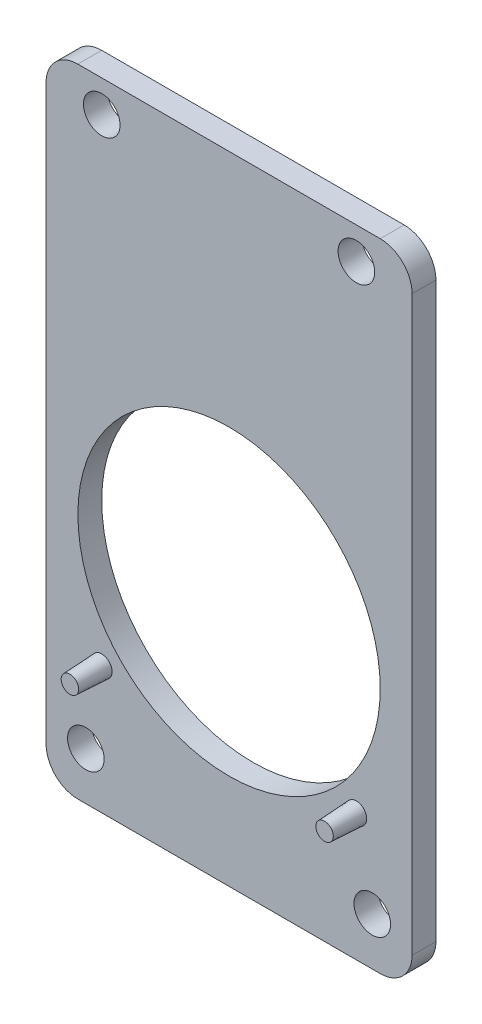
ISO-10303-21;
HEADER;
FILE_DESCRIPTION(('STEP AP214'),'2;1');
FILE_NAME('part.step','',(''),(''),'','','');
FILE_SCHEMA(('AUTOMOTIVE_DESIGN { 1 0 10303 214 1 1 1 1 }'));
ENDSEC;
DATA;
#1=APPLICATION_CONTEXT('core data for automotive mechanical design processes');
#2=APPLICATION_PROTOCOL_DEFINITION('international standard','automotive_design',2000,#1);
#3=PRODUCT_CONTEXT('',#1,'mechanical');
#4=PRODUCT('Part','Part','',(#3));
#5=PRODUCT_RELATED_PRODUCT_CATEGORY('part','',(#4));
#6=PRODUCT_DEFINITION_FORMATION('','',#4);
#7=PRODUCT_DEFINITION_CONTEXT('part definition',#1,'design');
#8=PRODUCT_DEFINITION('design','',#6,#7);
#9=PRODUCT_DEFINITION_SHAPE('','',#8);
#10=(LENGTH_UNIT() NAMED_UNIT(*) SI_UNIT(.MILLI.,.METRE.));
#11=(NAMED_UNIT(*) PLANE_ANGLE_UNIT() SI_UNIT($,.RADIAN.));
#12=(NAMED_UNIT(*) SI_UNIT($,.STERADIAN.) SOLID_ANGLE_UNIT());
#13=UNCERTAINTY_MEASURE_WITH_UNIT(LENGTH_MEASURE(1.E-05),#10,'distance_accuracy_value','');
#14=(GEOMETRIC_REPRESENTATION_CONTEXT(3) GLOBAL_UNCERTAINTY_ASSIGNED_CONTEXT((#13)) GLOBAL_UNIT_ASSIGNED_CONTEXT((#10,
#11,#12)) REPRESENTATION_CONTEXT('',''));
#15=CARTESIAN_POINT('',(0.,0.,0.));
#16=DIRECTION('',(0.,0.,1.));
#17=DIRECTION('',(1.,0.,0.));
#18=AXIS2_PLACEMENT_3D('',#15,#16,#17);
#19=CARTESIAN_POINT('',(0.,0.,1.5));
#20=DIRECTION('',(0.,0.,-1.));
#21=DIRECTION('',(-1.,0.,0.));
#22=AXIS2_PLACEMENT_3D('',#19,#20,#21);
#23=PLANE('',#22);
#24=CARTESIAN_POINT('',(8.,-12.,1.5));
#25=DIRECTION('',(0.,0.,-1.));
#26=DIRECTION('',(-1.,0.,0.));
#27=AXIS2_PLACEMENT_3D('',#24,#25,#26);
#28=CIRCLE('',#27,0.649999999999999);
#29=CARTESIAN_POINT('',(7.35,-12.,1.5));
#30=VERTEX_POINT('',#29);
#31=EDGE_CURVE('E193',#30,#30,#28,.F.);
#32=ORIENTED_EDGE('',*,*,#31,.F.);
#33=EDGE_LOOP('',(#32));
#34=FACE_BOUND('',#33,.T.);
#35=CARTESIAN_POINT('',(-8.,-12.,1.5));
#36=DIRECTION('',(0.,0.,-1.));
#37=DIRECTION('',(-1.,0.,0.));
#38=AXIS2_PLACEMENT_3D('',#35,#36,#37);
#39=CIRCLE('',#38,0.65);
#40=CARTESIAN_POINT('',(-8.65,-12.,1.5));
#41=VERTEX_POINT('',#40);
#42=EDGE_CURVE('E189',#41,#41,#39,.F.);
#43=ORIENTED_EDGE('',*,*,#42,.F.);
#44=EDGE_LOOP('',(#43));
#45=FACE_BOUND('',#44,.T.);
#46=CARTESIAN_POINT('',(8.,18.,1.5));
#47=DIRECTION('',(0.,0.,1.));
#48=DIRECTION('',(1.,0.,0.));
#49=AXIS2_PLACEMENT_3D('',#46,#47,#48);
#50=CIRCLE('',#49,1.15);
#51=CARTESIAN_POINT('',(9.15,18.,1.5));
#52=VERTEX_POINT('',#51);
#53=EDGE_CURVE('E301',#52,#52,#50,.T.);
#54=ORIENTED_EDGE('',*,*,#53,.F.);
#55=EDGE_LOOP('',(#54));
#56=FACE_BOUND('',#55,.T.);
#57=CARTESIAN_POINT('',(-9.,-17.,1.5));
#58=DIRECTION('',(0.,0.,1.));
#59=DIRECTION('',(1.,0.,0.));
#60=AXIS2_PLACEMENT_3D('',#57,#58,#59);
#61=CIRCLE('',#60,1.15);
#62=CARTESIAN_POINT('',(-7.85,-17.,1.5));
#63=VERTEX_POINT('',#62);
#64=EDGE_CURVE('E293',#63,#63,#61,.T.);
#65=ORIENTED_EDGE('',*,*,#64,.F.);
#66=EDGE_LOOP('',(#65));
#67=FACE_BOUND('',#66,.T.);
#68=CARTESIAN_POINT('',(9.,-17.,1.5));
#69=DIRECTION('',(0.,0.,1.));
#70=DIRECTION('',(1.,0.,0.));
#71=AXIS2_PLACEMENT_3D('',#68,#69,#70);
#72=CIRCLE('',#71,1.15);
#73=CARTESIAN_POINT('',(10.15,-17.,1.5));
#74=VERTEX_POINT('',#73);
#75=EDGE_CURVE('E308',#74,#74,#72,.T.);
#76=ORIENTED_EDGE('',*,*,#75,.F.);
#77=EDGE_LOOP('',(#76));
#78=FACE_BOUND('',#77,.T.);
#79=CARTESIAN_POINT('',(-8.,18.,1.5));
#80=DIRECTION('',(0.,0.,1.));
#81=DIRECTION('',(1.,0.,0.));
#82=AXIS2_PLACEMENT_3D('',#79,#80,#81);
#83=CIRCLE('',#82,1.15);
#84=CARTESIAN_POINT('',(-6.85,18.,1.5));
#85=VERTEX_POINT('',#84);
#86=EDGE_CURVE('E285',#85,#85,#83,.T.);
#87=ORIENTED_EDGE('',*,*,#86,.F.);
#88=EDGE_LOOP('',(#87));
#89=FACE_BOUND('',#88,.T.);
#90=DIRECTION('',(0.,-1.,0.));
#91=VECTOR('',#90,1.);
#92=CARTESIAN_POINT('',(-11.5,-20.,1.5));
#93=LINE('',#92,#91);
#94=CARTESIAN_POINT('',(-11.5,18.,1.5));
#95=VERTEX_POINT('',#94);
#96=CARTESIAN_POINT('',(-11.5,-18.,1.5));
#97=VERTEX_POINT('',#96);
#98=EDGE_CURVE('E272',#95,#97,#93,.T.);
#99=ORIENTED_EDGE('',*,*,#98,.T.);
#100=CARTESIAN_POINT('',(-9.5,-18.,1.5));
#101=DIRECTION('',(0.,0.,-1.));
#102=DIRECTION('',(-1.,0.,0.));
#103=AXIS2_PLACEMENT_3D('',#100,#101,#102);
#104=CIRCLE('',#103,2.);
#105=CARTESIAN_POINT('',(-9.5,-20.,1.5));
#106=VERTEX_POINT('',#105);
#107=EDGE_CURVE('E173',#97,#106,#104,.F.);
#108=ORIENTED_EDGE('',*,*,#107,.T.);
#109=DIRECTION('',(1.,0.,0.));
#110=VECTOR('',#109,1.);
#111=CARTESIAN_POINT('',(-11.5,-20.,1.5));
#112=LINE('',#111,#110);
#113=CARTESIAN_POINT('',(9.5,-20.,1.5));
#114=VERTEX_POINT('',#113);
#115=EDGE_CURVE('E130',#106,#114,#112,.T.);
#116=ORIENTED_EDGE('',*,*,#115,.T.);
#117=CARTESIAN_POINT('',(9.5,-18.,1.5));
#118=DIRECTION('',(0.,0.,-1.));
#119=DIRECTION('',(-1.,0.,0.));
#120=AXIS2_PLACEMENT_3D('',#117,#118,#119);
#121=CIRCLE('',#120,2.);
#122=CARTESIAN_POINT('',(11.5,-18.,1.5));
#123=VERTEX_POINT('',#122);
#124=EDGE_CURVE('E170',#114,#123,#121,.F.);
#125=ORIENTED_EDGE('',*,*,#124,.T.);
#126=DIRECTION('',(0.,1.,0.));
#127=VECTOR('',#126,1.);
#128=CARTESIAN_POINT('',(11.5,-20.,1.5));
#129=LINE('',#128,#127);
#130=CARTESIAN_POINT('',(11.5,18.,1.5));
#131=VERTEX_POINT('',#130);
#132=EDGE_CURVE('E139',#123,#131,#129,.T.);
#133=ORIENTED_EDGE('',*,*,#132,.T.);
#134=CARTESIAN_POINT('',(9.5,18.,1.5));
#135=DIRECTION('',(0.,0.,-1.));
#136=DIRECTION('',(-1.,0.,0.));
#137=AXIS2_PLACEMENT_3D('',#134,#135,#136);
#138=CIRCLE('',#137,2.);
#139=CARTESIAN_POINT('',(9.5,20.,1.5));
#140=VERTEX_POINT('',#139);
#141=EDGE_CURVE('E64',#131,#140,#138,.F.);
#142=ORIENTED_EDGE('',*,*,#141,.T.);
#143=DIRECTION('',(-1.,0.,0.));
#144=VECTOR('',#143,1.);
#145=CARTESIAN_POINT('',(-11.5,20.,1.5));
#146=LINE('',#145,#144);
#147=CARTESIAN_POINT('',(-9.5,20.,1.5));
#148=VERTEX_POINT('',#147);
#149=EDGE_CURVE('E144',#140,#148,#146,.T.);
#150=ORIENTED_EDGE('',*,*,#149,.T.);
#151=CARTESIAN_POINT('',(-9.5,18.,1.5));
#152=DIRECTION('',(0.,0.,-1.));
#153=DIRECTION('',(-1.,0.,0.));
#154=AXIS2_PLACEMENT_3D('',#151,#152,#153);
#155=CIRCLE('',#154,2.);
#156=EDGE_CURVE('E167',#148,#95,#155,.F.);
#157=ORIENTED_EDGE('',*,*,#156,.T.);
#158=EDGE_LOOP('',(#99,#108,#116,#125,#133,#142,#150,#157));
#159=FACE_BOUND('',#158,.T.);
#160=CARTESIAN_POINT('',(0.,-4.5,1.5));
#161=DIRECTION('',(0.,0.,1.));
#162=DIRECTION('',(1.,0.,0.));
#163=AXIS2_PLACEMENT_3D('',#160,#161,#162);
#164=CIRCLE('',#163,9.5);
#165=CARTESIAN_POINT('',(9.5,-4.5,1.5));
#166=VERTEX_POINT('',#165);
#167=EDGE_CURVE('E267',#166,#166,#164,.T.);
#168=ORIENTED_EDGE('',*,*,#167,.F.);
#169=EDGE_LOOP('',(#168));
#170=FACE_BOUND('',#169,.T.);
#171=ADVANCED_FACE('F40',(#34,#45,#56,#67,#78,#89,#159,#170),#23,.F.);
#172=CARTESIAN_POINT('',(0.,0.,0.));
#173=DIRECTION('',(0.,0.,-1.));
#174=DIRECTION('',(-1.,0.,0.));
#175=AXIS2_PLACEMENT_3D('',#172,#173,#174);
#176=PLANE('',#175);
#177=CARTESIAN_POINT('',(8.,18.,0.));
#178=DIRECTION('',(0.,0.,1.));
#179=DIRECTION('',(1.,0.,0.));
#180=AXIS2_PLACEMENT_3D('',#177,#178,#179);
#181=CIRCLE('',#180,1.15);
#182=CARTESIAN_POINT('',(9.15,18.,0.));
#183=VERTEX_POINT('',#182);
#184=EDGE_CURVE('E289',#183,#183,#181,.T.);
#185=ORIENTED_EDGE('',*,*,#184,.T.);
#186=EDGE_LOOP('',(#185));
#187=FACE_BOUND('',#186,.T.);
#188=CARTESIAN_POINT('',(-9.,-17.,0.));
#189=DIRECTION('',(0.,0.,1.));
#190=DIRECTION('',(1.,0.,0.));
#191=AXIS2_PLACEMENT_3D('',#188,#189,#190);
#192=CIRCLE('',#191,1.15);
#193=CARTESIAN_POINT('',(-7.85,-17.,0.));
#194=VERTEX_POINT('',#193);
#195=EDGE_CURVE('E296',#194,#194,#192,.T.);
#196=ORIENTED_EDGE('',*,*,#195,.T.);
#197=EDGE_LOOP('',(#196));
#198=FACE_BOUND('',#197,.T.);
#199=CARTESIAN_POINT('',(9.,-17.,0.));
#200=DIRECTION('',(0.,0.,1.));
#201=DIRECTION('',(1.,0.,0.));
#202=AXIS2_PLACEMENT_3D('',#199,#200,#201);
#203=CIRCLE('',#202,1.15);
#204=CARTESIAN_POINT('',(10.15,-17.,0.));
#205=VERTEX_POINT('',#204);
#206=EDGE_CURVE('E297',#205,#205,#203,.T.);
#207=ORIENTED_EDGE('',*,*,#206,.T.);
#208=EDGE_LOOP('',(#207));
#209=FACE_BOUND('',#208,.T.);
#210=CARTESIAN_POINT('',(-8.,18.,0.));
#211=DIRECTION('',(0.,0.,1.));
#212=DIRECTION('',(1.,0.,0.));
#213=AXIS2_PLACEMENT_3D('',#210,#211,#212);
#214=CIRCLE('',#213,1.15);
#215=CARTESIAN_POINT('',(-6.85,18.,0.));
#216=VERTEX_POINT('',#215);
#217=EDGE_CURVE('E281',#216,#216,#214,.T.);
#218=ORIENTED_EDGE('',*,*,#217,.T.);
#219=EDGE_LOOP('',(#218));
#220=FACE_BOUND('',#219,.T.);
#221=DIRECTION('',(1.,0.,0.));
#222=VECTOR('',#221,1.);
#223=CARTESIAN_POINT('',(-11.5,-20.,0.));
#224=LINE('',#223,#222);
#225=CARTESIAN_POINT('',(-9.5,-20.,0.));
#226=VERTEX_POINT('',#225);
#227=CARTESIAN_POINT('',(9.5,-20.,0.));
#228=VERTEX_POINT('',#227);
#229=EDGE_CURVE('E127',#226,#228,#224,.T.);
#230=ORIENTED_EDGE('',*,*,#229,.F.);
#231=CARTESIAN_POINT('',(-9.5,-18.,0.));
#232=DIRECTION('',(0.,0.,-1.));
#233=DIRECTION('',(-1.,0.,0.));
#234=AXIS2_PLACEMENT_3D('',#231,#232,#233);
#235=CIRCLE('',#234,2.);
#236=CARTESIAN_POINT('',(-11.5,-18.,0.));
#237=VERTEX_POINT('',#236);
#238=EDGE_CURVE('E109',#226,#237,#235,.T.);
#239=ORIENTED_EDGE('',*,*,#238,.T.);
#240=DIRECTION('',(0.,-1.,0.));
#241=VECTOR('',#240,1.);
#242=CARTESIAN_POINT('',(-11.5,-20.,0.));
#243=LINE('',#242,#241);
#244=CARTESIAN_POINT('',(-11.5,18.,0.));
#245=VERTEX_POINT('',#244);
#246=EDGE_CURVE('E140',#245,#237,#243,.T.);
#247=ORIENTED_EDGE('',*,*,#246,.F.);
#248=CARTESIAN_POINT('',(-9.5,18.,0.));
#249=DIRECTION('',(0.,0.,-1.));
#250=DIRECTION('',(-1.,0.,0.));
#251=AXIS2_PLACEMENT_3D('',#248,#249,#250);
#252=CIRCLE('',#251,2.);
#253=CARTESIAN_POINT('',(-9.5,20.,0.));
#254=VERTEX_POINT('',#253);
#255=EDGE_CURVE('E155',#245,#254,#252,.T.);
#256=ORIENTED_EDGE('',*,*,#255,.T.);
#257=DIRECTION('',(-1.,0.,0.));
#258=VECTOR('',#257,1.);
#259=CARTESIAN_POINT('',(-11.5,20.,0.));
#260=LINE('',#259,#258);
#261=CARTESIAN_POINT('',(9.5,20.,0.));
#262=VERTEX_POINT('',#261);
#263=EDGE_CURVE('E147',#262,#254,#260,.T.);
#264=ORIENTED_EDGE('',*,*,#263,.F.);
#265=CARTESIAN_POINT('',(9.5,18.,0.));
#266=DIRECTION('',(0.,0.,-1.));
#267=DIRECTION('',(-1.,0.,0.));
#268=AXIS2_PLACEMENT_3D('',#265,#266,#267);
#269=CIRCLE('',#268,2.);
#270=CARTESIAN_POINT('',(11.5,18.,0.));
#271=VERTEX_POINT('',#270);
#272=EDGE_CURVE('E132',#262,#271,#269,.T.);
#273=ORIENTED_EDGE('',*,*,#272,.T.);
#274=DIRECTION('',(0.,1.,0.));
#275=VECTOR('',#274,1.);
#276=CARTESIAN_POINT('',(11.5,-20.,0.));
#277=LINE('',#276,#275);
#278=CARTESIAN_POINT('',(11.5,-18.,0.));
#279=VERTEX_POINT('',#278);
#280=EDGE_CURVE('E264',#279,#271,#277,.T.);
#281=ORIENTED_EDGE('',*,*,#280,.F.);
#282=CARTESIAN_POINT('',(9.5,-18.,0.));
#283=DIRECTION('',(0.,0.,-1.));
#284=DIRECTION('',(-1.,0.,0.));
#285=AXIS2_PLACEMENT_3D('',#282,#283,#284);
#286=CIRCLE('',#285,2.);
#287=EDGE_CURVE('E121',#279,#228,#286,.T.);
#288=ORIENTED_EDGE('',*,*,#287,.T.);
#289=EDGE_LOOP('',(#230,#239,#247,#256,#264,#273,#281,#288));
#290=FACE_BOUND('',#289,.T.);
#291=CARTESIAN_POINT('',(0.,-4.5,0.));
#292=DIRECTION('',(0.,0.,1.));
#293=DIRECTION('',(1.,0.,0.));
#294=AXIS2_PLACEMENT_3D('',#291,#292,#293);
#295=CIRCLE('',#294,9.5);
#296=CARTESIAN_POINT('',(9.5,-4.5,0.));
#297=VERTEX_POINT('',#296);
#298=EDGE_CURVE('E277',#297,#297,#295,.T.);
#299=ORIENTED_EDGE('',*,*,#298,.T.);
#300=EDGE_LOOP('',(#299));
#301=FACE_BOUND('',#300,.T.);
#302=ADVANCED_FACE('F135',(#187,#198,#209,#220,#290,#301),#176,.T.);
#303=CARTESIAN_POINT('',(11.5,-20.,1.5));
#304=DIRECTION('',(-1.,0.,0.));
#305=DIRECTION('',(0.,0.,1.));
#306=AXIS2_PLACEMENT_3D('',#303,#304,#305);
#307=PLANE('',#306);
#308=ORIENTED_EDGE('',*,*,#132,.F.);
#309=DIRECTION('',(0.,0.,-1.));
#310=VECTOR('',#309,1.);
#311=CARTESIAN_POINT('',(11.5,-18.,1.5));
#312=LINE('',#311,#310);
#313=EDGE_CURVE('E179',#123,#279,#312,.T.);
#314=ORIENTED_EDGE('',*,*,#313,.T.);
#315=ORIENTED_EDGE('',*,*,#280,.T.);
#316=DIRECTION('',(0.,0.,-1.));
#317=VECTOR('',#316,1.);
#318=CARTESIAN_POINT('',(11.5,18.,1.5));
#319=LINE('',#318,#317);
#320=EDGE_CURVE('E176',#271,#131,#319,.F.);
#321=ORIENTED_EDGE('',*,*,#320,.T.);
#322=EDGE_LOOP('',(#308,#314,#315,#321));
#323=FACE_BOUND('',#322,.T.);
#324=ADVANCED_FACE('F221',(#323),#307,.F.);
#325=CARTESIAN_POINT('',(-11.5,20.,1.5));
#326=DIRECTION('',(0.,-1.,0.));
#327=DIRECTION('',(0.,0.,-1.));
#328=AXIS2_PLACEMENT_3D('',#325,#326,#327);
#329=PLANE('',#328);
#330=ORIENTED_EDGE('',*,*,#263,.T.);
#331=DIRECTION('',(0.,0.,-1.));
#332=VECTOR('',#331,1.);
#333=CARTESIAN_POINT('',(-9.5,20.,1.5));
#334=LINE('',#333,#332);
#335=EDGE_CURVE('E57',#254,#148,#334,.F.);
#336=ORIENTED_EDGE('',*,*,#335,.T.);
#337=ORIENTED_EDGE('',*,*,#149,.F.);
#338=DIRECTION('',(0.,0.,-1.));
#339=VECTOR('',#338,1.);
#340=CARTESIAN_POINT('',(9.5,20.,1.5));
#341=LINE('',#340,#339);
#342=EDGE_CURVE('E183',#140,#262,#341,.T.);
#343=ORIENTED_EDGE('',*,*,#342,.T.);
#344=EDGE_LOOP('',(#330,#336,#337,#343));
#345=FACE_BOUND('',#344,.T.);
#346=ADVANCED_FACE('F235',(#345),#329,.F.);
#347=CARTESIAN_POINT('',(-11.5,-20.,1.5));
#348=DIRECTION('',(1.,0.,0.));
#349=DIRECTION('',(0.,0.,-1.));
#350=AXIS2_PLACEMENT_3D('',#347,#348,#349);
#351=PLANE('',#350);
#352=ORIENTED_EDGE('',*,*,#246,.T.);
#353=DIRECTION('',(0.,0.,-1.));
#354=VECTOR('',#353,1.);
#355=CARTESIAN_POINT('',(-11.5,-18.,1.5));
#356=LINE('',#355,#354);
#357=EDGE_CURVE('E114',#237,#97,#356,.F.);
#358=ORIENTED_EDGE('',*,*,#357,.T.);
#359=ORIENTED_EDGE('',*,*,#98,.F.);
#360=DIRECTION('',(0.,0.,-1.));
#361=VECTOR('',#360,1.);
#362=CARTESIAN_POINT('',(-11.5,18.,1.5));
#363=LINE('',#362,#361);
#364=EDGE_CURVE('E120',#95,#245,#363,.T.);
#365=ORIENTED_EDGE('',*,*,#364,.T.);
#366=EDGE_LOOP('',(#352,#358,#359,#365));
#367=FACE_BOUND('',#366,.T.);
#368=ADVANCED_FACE('F232',(#367),#351,.F.);
#369=CARTESIAN_POINT('',(-11.5,-20.,1.5));
#370=DIRECTION('',(0.,1.,0.));
#371=DIRECTION('',(0.,0.,1.));
#372=AXIS2_PLACEMENT_3D('',#369,#370,#371);
#373=PLANE('',#372);
#374=ORIENTED_EDGE('',*,*,#115,.F.);
#375=DIRECTION('',(0.,0.,-1.));
#376=VECTOR('',#375,1.);
#377=CARTESIAN_POINT('',(-9.5,-20.,1.5));
#378=LINE('',#377,#376);
#379=EDGE_CURVE('E113',#106,#226,#378,.T.);
#380=ORIENTED_EDGE('',*,*,#379,.T.);
#381=ORIENTED_EDGE('',*,*,#229,.T.);
#382=DIRECTION('',(0.,0.,-1.));
#383=VECTOR('',#382,1.);
#384=CARTESIAN_POINT('',(9.5,-20.,1.5));
#385=LINE('',#384,#383);
#386=EDGE_CURVE('E133',#228,#114,#385,.F.);
#387=ORIENTED_EDGE('',*,*,#386,.T.);
#388=EDGE_LOOP('',(#374,#380,#381,#387));
#389=FACE_BOUND('',#388,.T.);
#390=ADVANCED_FACE('F126',(#389),#373,.F.);
#391=CARTESIAN_POINT('',(0.,-4.5,1.5));
#392=DIRECTION('',(0.,0.,-1.));
#393=DIRECTION('',(-1.,0.,0.));
#394=AXIS2_PLACEMENT_3D('',#391,#392,#393);
#395=CYLINDRICAL_SURFACE('',#394,9.5);
#396=ORIENTED_EDGE('',*,*,#167,.T.);
#397=EDGE_LOOP('',(#396));
#398=FACE_BOUND('',#397,.T.);
#399=ORIENTED_EDGE('',*,*,#298,.F.);
#400=EDGE_LOOP('',(#399));
#401=FACE_BOUND('',#400,.T.);
#402=ADVANCED_FACE('F227',(#398,#401),#395,.F.);
#403=CARTESIAN_POINT('',(-9.5,-18.,1.5));
#404=DIRECTION('',(0.,0.,-1.));
#405=DIRECTION('',(-1.,0.,0.));
#406=AXIS2_PLACEMENT_3D('',#403,#404,#405);
#407=CYLINDRICAL_SURFACE('',#406,2.);
#408=ORIENTED_EDGE('',*,*,#107,.F.);
#409=ORIENTED_EDGE('',*,*,#357,.F.);
#410=ORIENTED_EDGE('',*,*,#238,.F.);
#411=ORIENTED_EDGE('',*,*,#379,.F.);
#412=EDGE_LOOP('',(#408,#409,#410,#411));
#413=FACE_BOUND('',#412,.T.);
#414=ADVANCED_FACE('F112',(#413),#407,.T.);
#415=CARTESIAN_POINT('',(9.5,-18.,1.5));
#416=DIRECTION('',(0.,0.,-1.));
#417=DIRECTION('',(-1.,0.,0.));
#418=AXIS2_PLACEMENT_3D('',#415,#416,#417);
#419=CYLINDRICAL_SURFACE('',#418,2.);
#420=ORIENTED_EDGE('',*,*,#124,.F.);
#421=ORIENTED_EDGE('',*,*,#386,.F.);
#422=ORIENTED_EDGE('',*,*,#287,.F.);
#423=ORIENTED_EDGE('',*,*,#313,.F.);
#424=EDGE_LOOP('',(#420,#421,#422,#423));
#425=FACE_BOUND('',#424,.T.);
#426=ADVANCED_FACE('F244',(#425),#419,.T.);
#427=CARTESIAN_POINT('',(-9.5,18.,1.5));
#428=DIRECTION('',(0.,0.,-1.));
#429=DIRECTION('',(-1.,0.,0.));
#430=AXIS2_PLACEMENT_3D('',#427,#428,#429);
#431=CYLINDRICAL_SURFACE('',#430,2.);
#432=ORIENTED_EDGE('',*,*,#156,.F.);
#433=ORIENTED_EDGE('',*,*,#335,.F.);
#434=ORIENTED_EDGE('',*,*,#255,.F.);
#435=ORIENTED_EDGE('',*,*,#364,.F.);
#436=EDGE_LOOP('',(#432,#433,#434,#435));
#437=FACE_BOUND('',#436,.T.);
#438=ADVANCED_FACE('F247',(#437),#431,.T.);
#439=CARTESIAN_POINT('',(9.5,18.,1.5));
#440=DIRECTION('',(0.,0.,-1.));
#441=DIRECTION('',(-1.,0.,0.));
#442=AXIS2_PLACEMENT_3D('',#439,#440,#441);
#443=CYLINDRICAL_SURFACE('',#442,2.);
#444=ORIENTED_EDGE('',*,*,#141,.F.);
#445=ORIENTED_EDGE('',*,*,#320,.F.);
#446=ORIENTED_EDGE('',*,*,#272,.F.);
#447=ORIENTED_EDGE('',*,*,#342,.F.);
#448=EDGE_LOOP('',(#444,#445,#446,#447));
#449=FACE_BOUND('',#448,.T.);
#450=ADVANCED_FACE('F250',(#449),#443,.T.);
#451=CARTESIAN_POINT('',(-8.,18.,0.));
#452=DIRECTION('',(0.,0.,1.));
#453=DIRECTION('',(1.,0.,0.));
#454=AXIS2_PLACEMENT_3D('',#451,#452,#453);
#455=CYLINDRICAL_SURFACE('',#454,1.15);
#456=ORIENTED_EDGE('',*,*,#217,.F.);
#457=EDGE_LOOP('',(#456));
#458=FACE_BOUND('',#457,.T.);
#459=ORIENTED_EDGE('',*,*,#86,.T.);
#460=EDGE_LOOP('',(#459));
#461=FACE_BOUND('',#460,.T.);
#462=ADVANCED_FACE('F253',(#458,#461),#455,.F.);
#463=CARTESIAN_POINT('',(9.,-17.,0.));
#464=DIRECTION('',(0.,0.,1.));
#465=DIRECTION('',(1.,0.,0.));
#466=AXIS2_PLACEMENT_3D('',#463,#464,#465);
#467=CYLINDRICAL_SURFACE('',#466,1.15);
#468=ORIENTED_EDGE('',*,*,#206,.F.);
#469=EDGE_LOOP('',(#468));
#470=FACE_BOUND('',#469,.T.);
#471=ORIENTED_EDGE('',*,*,#75,.T.);
#472=EDGE_LOOP('',(#471));
#473=FACE_BOUND('',#472,.T.);
#474=ADVANCED_FACE('F258',(#470,#473),#467,.F.);
#475=CARTESIAN_POINT('',(-9.,-17.,0.));
#476=DIRECTION('',(0.,0.,1.));
#477=DIRECTION('',(1.,0.,0.));
#478=AXIS2_PLACEMENT_3D('',#475,#476,#477);
#479=CYLINDRICAL_SURFACE('',#478,1.15);
#480=ORIENTED_EDGE('',*,*,#195,.F.);
#481=EDGE_LOOP('',(#480));
#482=FACE_BOUND('',#481,.T.);
#483=ORIENTED_EDGE('',*,*,#64,.T.);
#484=EDGE_LOOP('',(#483));
#485=FACE_BOUND('',#484,.T.);
#486=ADVANCED_FACE('F320',(#482,#485),#479,.F.);
#487=CARTESIAN_POINT('',(8.,18.,0.));
#488=DIRECTION('',(0.,0.,1.));
#489=DIRECTION('',(1.,0.,0.));
#490=AXIS2_PLACEMENT_3D('',#487,#488,#489);
#491=CYLINDRICAL_SURFACE('',#490,1.15);
#492=ORIENTED_EDGE('',*,*,#184,.F.);
#493=EDGE_LOOP('',(#492));
#494=FACE_BOUND('',#493,.T.);
#495=ORIENTED_EDGE('',*,*,#53,.T.);
#496=EDGE_LOOP('',(#495));
#497=FACE_BOUND('',#496,.T.);
#498=ADVANCED_FACE('F367',(#494,#497),#491,.F.);
#499=CARTESIAN_POINT('',(-8.,-12.,3.5));
#500=DIRECTION('',(0.,0.,1.));
#501=DIRECTION('',(1.,0.,0.));
#502=AXIS2_PLACEMENT_3D('',#499,#500,#501);
#503=PLANE('',#502);
#504=CARTESIAN_POINT('',(-8.,-12.,3.5));
#505=DIRECTION('',(0.,0.,1.));
#506=DIRECTION('',(1.,0.,0.));
#507=AXIS2_PLACEMENT_3D('',#504,#505,#506);
#508=CIRCLE('',#507,0.549999999999997);
#509=CARTESIAN_POINT('',(-7.45,-12.,3.5));
#510=VERTEX_POINT('',#509);
#511=EDGE_CURVE('E11',#510,#510,#508,.T.);
#512=ORIENTED_EDGE('',*,*,#511,.T.);
#513=EDGE_LOOP('',(#512));
#514=FACE_BOUND('',#513,.T.);
#515=ADVANCED_FACE('F211',(#514),#503,.T.);
#516=CARTESIAN_POINT('',(8.,-12.,3.5));
#517=DIRECTION('',(0.,0.,1.));
#518=DIRECTION('',(1.,0.,0.));
#519=AXIS2_PLACEMENT_3D('',#516,#517,#518);
#520=PLANE('',#519);
#521=CARTESIAN_POINT('',(8.,-12.,3.5));
#522=DIRECTION('',(0.,0.,1.));
#523=DIRECTION('',(1.,0.,0.));
#524=AXIS2_PLACEMENT_3D('',#521,#522,#523);
#525=CIRCLE('',#524,0.54999999999995);
#526=CARTESIAN_POINT('',(8.54999999999995,-12.,3.5));
#527=VERTEX_POINT('',#526);
#528=EDGE_CURVE('E50',#527,#527,#525,.T.);
#529=ORIENTED_EDGE('',*,*,#528,.T.);
#530=EDGE_LOOP('',(#529));
#531=FACE_BOUND('',#530,.T.);
#532=ADVANCED_FACE('F201',(#531),#520,.T.);
#533=CARTESIAN_POINT('',(8.,-12.,3.5));
#534=DIRECTION('',(0.,0.,-1.));
#535=DIRECTION('',(-1.,0.,0.));
#536=AXIS2_PLACEMENT_3D('',#533,#534,#535);
#537=CONICAL_SURFACE('',#536,0.54999999999995,0.0499583957219398);
#538=ORIENTED_EDGE('',*,*,#31,.T.);
#539=EDGE_LOOP('',(#538));
#540=FACE_BOUND('',#539,.T.);
#541=ORIENTED_EDGE('',*,*,#528,.F.);
#542=EDGE_LOOP('',(#541));
#543=FACE_BOUND('',#542,.T.);
#544=ADVANCED_FACE('F203',(#540,#543),#537,.T.);
#545=CARTESIAN_POINT('',(-8.,-12.,3.5));
#546=DIRECTION('',(0.,0.,-1.));
#547=DIRECTION('',(-1.,0.,0.));
#548=AXIS2_PLACEMENT_3D('',#545,#546,#547);
#549=CONICAL_SURFACE('',#548,0.549999999999997,0.0499583957219388);
#550=ORIENTED_EDGE('',*,*,#42,.T.);
#551=EDGE_LOOP('',(#550));
#552=FACE_BOUND('',#551,.T.);
#553=ORIENTED_EDGE('',*,*,#511,.F.);
#554=EDGE_LOOP('',(#553));
#555=FACE_BOUND('',#554,.T.);
#556=ADVANCED_FACE('F43',(#552,#555),#549,.T.);
#557=CLOSED_SHELL('',(#171,#302,#324,#346,#368,#390,#402,#414,#426,#438,#450,#462,#474,#486,
#498,#515,#532,#544,#556));
#558=MANIFOLD_SOLID_BREP('B2',#557);
#559=ADVANCED_BREP_SHAPE_REPRESENTATION('',(#18,#558),#14);
#560=SHAPE_DEFINITION_REPRESENTATION(#9,#559);
ENDSEC;
END-ISO-10303-21;
